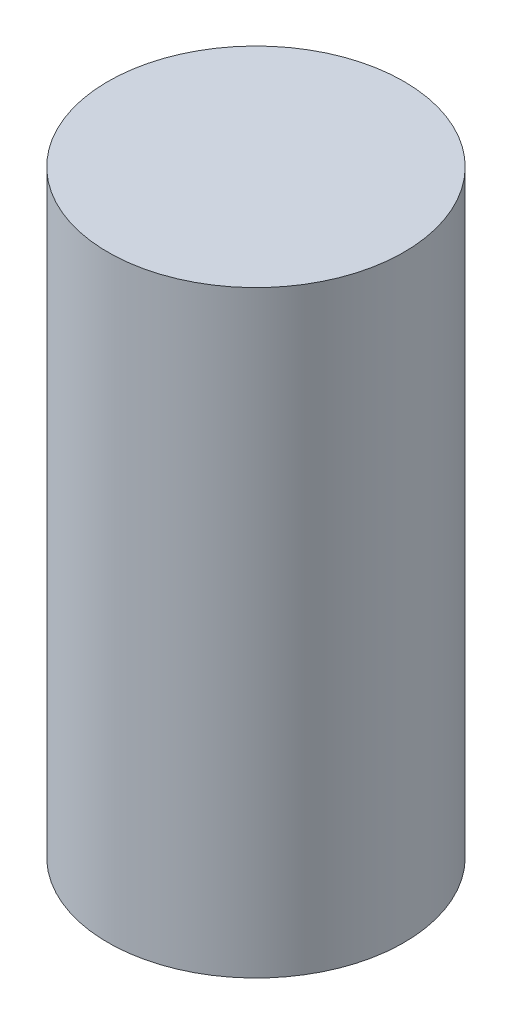
ISO-10303-21;
HEADER;
FILE_DESCRIPTION(('STEP AP214'),'2;1');
FILE_NAME('part.step','',(''),(''),'','','');
FILE_SCHEMA(('AUTOMOTIVE_DESIGN { 1 0 10303 214 1 1 1 1 }'));
ENDSEC;
DATA;
#1=APPLICATION_CONTEXT('core data for automotive mechanical design processes');
#2=APPLICATION_PROTOCOL_DEFINITION('international standard','automotive_design',2000,#1);
#3=PRODUCT_CONTEXT('',#1,'mechanical');
#4=PRODUCT('Part','Part','',(#3));
#5=PRODUCT_RELATED_PRODUCT_CATEGORY('part','',(#4));
#6=PRODUCT_DEFINITION_FORMATION('','',#4);
#7=PRODUCT_DEFINITION_CONTEXT('part definition',#1,'design');
#8=PRODUCT_DEFINITION('design','',#6,#7);
#9=PRODUCT_DEFINITION_SHAPE('','',#8);
#10=(LENGTH_UNIT() NAMED_UNIT(*) SI_UNIT(.MILLI.,.METRE.));
#11=(NAMED_UNIT(*) PLANE_ANGLE_UNIT() SI_UNIT($,.RADIAN.));
#12=(NAMED_UNIT(*) SI_UNIT($,.STERADIAN.) SOLID_ANGLE_UNIT());
#13=UNCERTAINTY_MEASURE_WITH_UNIT(LENGTH_MEASURE(1.E-05),#10,'distance_accuracy_value','');
#14=(GEOMETRIC_REPRESENTATION_CONTEXT(3) GLOBAL_UNCERTAINTY_ASSIGNED_CONTEXT((#13)) GLOBAL_UNIT_ASSIGNED_CONTEXT((#10,
#11,#12)) REPRESENTATION_CONTEXT('',''));
#15=CARTESIAN_POINT('',(0.,0.,0.));
#16=DIRECTION('',(0.,0.,1.));
#17=DIRECTION('',(1.,0.,0.));
#18=AXIS2_PLACEMENT_3D('',#15,#16,#17);
#19=CARTESIAN_POINT('',(0.,4.95,0.));
#20=DIRECTION('',(0.,-1.,0.));
#21=DIRECTION('',(0.,0.,-1.));
#22=AXIS2_PLACEMENT_3D('',#19,#20,#21);
#23=CYLINDRICAL_SURFACE('',#22,2.45);
#24=CARTESIAN_POINT('',(0.,4.95,0.));
#25=DIRECTION('',(0.,1.,0.));
#26=DIRECTION('',(0.,0.,1.));
#27=AXIS2_PLACEMENT_3D('',#24,#25,#26);
#28=CIRCLE('',#27,2.45);
#29=CARTESIAN_POINT('',(0.,4.95,-2.45));
#30=VERTEX_POINT('',#29);
#31=EDGE_CURVE('E10',#30,#30,#28,.T.);
#32=CARTESIAN_POINT('',(0.,-4.95,0.));
#33=DIRECTION('',(0.,1.,0.));
#34=DIRECTION('',(0.,0.,1.));
#35=AXIS2_PLACEMENT_3D('',#32,#33,#34);
#36=CIRCLE('',#35,2.45);
#37=CARTESIAN_POINT('',(0.,-4.95,-2.45));
#38=VERTEX_POINT('',#37);
#39=EDGE_CURVE('E39',#38,#38,#36,.T.);
#40=CARTESIAN_POINT('',(0.,4.95,-2.45));
#41=CARTESIAN_POINT('',(0.,4.846875,-2.45));
#42=CARTESIAN_POINT('',(0.,4.74375,-2.45));
#43=CARTESIAN_POINT('',(0.,4.5375,-2.45));
#44=CARTESIAN_POINT('',(0.,4.434375,-2.45));
#45=CARTESIAN_POINT('',(0.,4.228125,-2.45));
#46=CARTESIAN_POINT('',(0.,4.125,-2.45));
#47=CARTESIAN_POINT('',(0.,3.91875,-2.45));
#48=CARTESIAN_POINT('',(0.,3.815625,-2.45));
#49=CARTESIAN_POINT('',(0.,3.609375,-2.45));
#50=CARTESIAN_POINT('',(0.,3.50625,-2.45));
#51=CARTESIAN_POINT('',(0.,3.3,-2.45));
#52=CARTESIAN_POINT('',(0.,3.196875,-2.45));
#53=CARTESIAN_POINT('',(0.,2.990625,-2.45));
#54=CARTESIAN_POINT('',(0.,2.8875,-2.45));
#55=CARTESIAN_POINT('',(0.,2.68125,-2.45));
#56=CARTESIAN_POINT('',(0.,2.578125,-2.45));
#57=CARTESIAN_POINT('',(0.,2.371875,-2.45));
#58=CARTESIAN_POINT('',(0.,2.26875,-2.45));
#59=CARTESIAN_POINT('',(0.,2.0625,-2.45));
#60=CARTESIAN_POINT('',(0.,1.959375,-2.45));
#61=CARTESIAN_POINT('',(0.,1.753125,-2.45));
#62=CARTESIAN_POINT('',(0.,1.65,-2.45));
#63=CARTESIAN_POINT('',(0.,1.44375,-2.45));
#64=CARTESIAN_POINT('',(0.,1.340625,-2.45));
#65=CARTESIAN_POINT('',(0.,1.134375,-2.45));
#66=CARTESIAN_POINT('',(0.,1.03125,-2.45));
#67=CARTESIAN_POINT('',(0.,0.825,-2.45));
#68=CARTESIAN_POINT('',(0.,0.721875,-2.45));
#69=CARTESIAN_POINT('',(0.,0.515625,-2.45));
#70=CARTESIAN_POINT('',(0.,0.4125,-2.45));
#71=CARTESIAN_POINT('',(0.,0.20625,-2.45));
#72=CARTESIAN_POINT('',(0.,0.103125,-2.45));
#73=CARTESIAN_POINT('',(0.,-0.103125,-2.45));
#74=CARTESIAN_POINT('',(0.,-0.20625,-2.45));
#75=CARTESIAN_POINT('',(0.,-0.4125,-2.45));
#76=CARTESIAN_POINT('',(0.,-0.515625,-2.45));
#77=CARTESIAN_POINT('',(0.,-0.721875,-2.45));
#78=CARTESIAN_POINT('',(0.,-0.825,-2.45));
#79=CARTESIAN_POINT('',(0.,-1.03125,-2.45));
#80=CARTESIAN_POINT('',(0.,-1.134375,-2.45));
#81=CARTESIAN_POINT('',(0.,-1.340625,-2.45));
#82=CARTESIAN_POINT('',(0.,-1.44375,-2.45));
#83=CARTESIAN_POINT('',(0.,-1.65,-2.45));
#84=CARTESIAN_POINT('',(0.,-1.753125,-2.45));
#85=CARTESIAN_POINT('',(0.,-1.959375,-2.45));
#86=CARTESIAN_POINT('',(0.,-2.0625,-2.45));
#87=CARTESIAN_POINT('',(0.,-2.26875,-2.45));
#88=CARTESIAN_POINT('',(0.,-2.371875,-2.45));
#89=CARTESIAN_POINT('',(0.,-2.578125,-2.45));
#90=CARTESIAN_POINT('',(0.,-2.68125,-2.45));
#91=CARTESIAN_POINT('',(0.,-2.8875,-2.45));
#92=CARTESIAN_POINT('',(0.,-2.990625,-2.45));
#93=CARTESIAN_POINT('',(0.,-3.196875,-2.45));
#94=CARTESIAN_POINT('',(0.,-3.3,-2.45));
#95=CARTESIAN_POINT('',(0.,-3.50625,-2.45));
#96=CARTESIAN_POINT('',(0.,-3.609375,-2.45));
#97=CARTESIAN_POINT('',(0.,-3.815625,-2.45));
#98=CARTESIAN_POINT('',(0.,-3.91875,-2.45));
#99=CARTESIAN_POINT('',(0.,-4.125,-2.45));
#100=CARTESIAN_POINT('',(0.,-4.228125,-2.45));
#101=CARTESIAN_POINT('',(0.,-4.434375,-2.45));
#102=CARTESIAN_POINT('',(0.,-4.5375,-2.45));
#103=CARTESIAN_POINT('',(0.,-4.74375,-2.45));
#104=CARTESIAN_POINT('',(0.,-4.846875,-2.45));
#105=CARTESIAN_POINT('',(0.,-4.95,-2.45));
#106=B_SPLINE_CURVE_WITH_KNOTS('',3,(#40,#41,#42,#43,#44,#45,#46,#47,#48,#49,#50,#51,#52,#53,
#54,#55,#56,#57,#58,#59,#60,#61,#62,#63,#64,#65,#66,#67,#68,#69,#70,#71,#72,#73,#74,#75,#76,#77,
#78,#79,#80,#81,#82,#83,#84,#85,#86,#87,#88,#89,#90,#91,#92,#93,#94,#95,#96,#97,#98,#99,#100,
#101,#102,#103,#104,#105),.UNSPECIFIED.,.F.,.F.,(4,2,2,2,2,2,2,2,2,2,2,2,2,2,2,2,2,2,2,2,2,2,2,
2,2,2,2,2,2,2,2,2,4),(0.,0.309375000000001,0.61875,0.928125000000001,1.2375,1.546875,1.85625,
2.165625,2.475,2.784375,3.09375,3.403125,3.7125,4.021875,4.33125,4.640625,4.95,5.259375,5.56875,
5.878125,6.1875,6.496875,6.80625,7.115625,7.425,7.734375,8.04375,8.353125,8.6625,8.971875,
9.28125,9.590625,9.9),.UNSPECIFIED.);
#107=EDGE_CURVE('BSEAM36',#30,#38,#106,.T.);
#108=ORIENTED_EDGE('',*,*,#31,.F.);
#109=ORIENTED_EDGE('',*,*,#39,.T.);
#110=ORIENTED_EDGE('',*,*,#107,.T.);
#111=ORIENTED_EDGE('',*,*,#107,.F.);
#112=EDGE_LOOP('',(#108,#110,#109,#111));
#113=FACE_BOUND('',#112,.T.);
#114=ADVANCED_FACE('F36',(#113),#23,.T.);
#115=CARTESIAN_POINT('',(0.,4.95,0.));
#116=DIRECTION('',(0.,1.,0.));
#117=DIRECTION('',(0.,0.,1.));
#118=AXIS2_PLACEMENT_3D('',#115,#116,#117);
#119=PLANE('',#118);
#120=ORIENTED_EDGE('',*,*,#31,.T.);
#121=EDGE_LOOP('',(#120));
#122=FACE_BOUND('',#121,.T.);
#123=ADVANCED_FACE('F51',(#122),#119,.T.);
#124=CARTESIAN_POINT('',(0.,-4.95,0.));
#125=DIRECTION('',(0.,1.,0.));
#126=DIRECTION('',(0.,0.,1.));
#127=AXIS2_PLACEMENT_3D('',#124,#125,#126);
#128=PLANE('',#127);
#129=ORIENTED_EDGE('',*,*,#39,.F.);
#130=EDGE_LOOP('',(#129));
#131=FACE_BOUND('',#130,.T.);
#132=ADVANCED_FACE('F49',(#131),#128,.F.);
#133=CLOSED_SHELL('',(#114,#123,#132));
#134=MANIFOLD_SOLID_BREP('B2',#133);
#135=ADVANCED_BREP_SHAPE_REPRESENTATION('',(#18,#134),#14);
#136=SHAPE_DEFINITION_REPRESENTATION(#9,#135);
ENDSEC;
END-ISO-10303-21;
